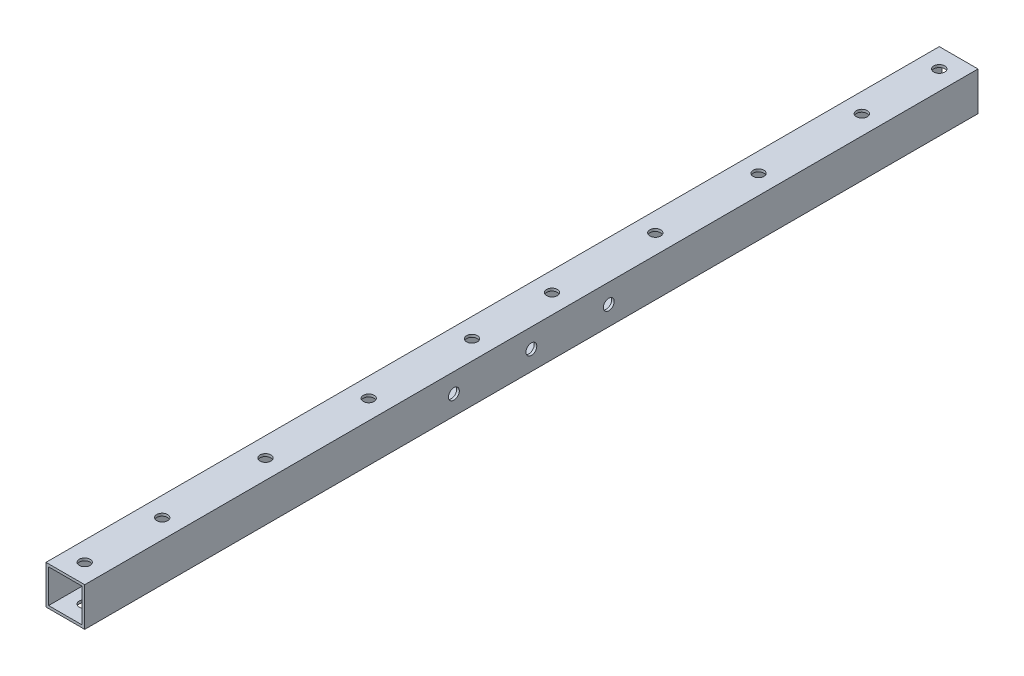
ISO-10303-21;
HEADER;
FILE_DESCRIPTION(('STEP AP214'),'2;1');
FILE_NAME('part.step','',(''),(''),'','','');
FILE_SCHEMA(('AUTOMOTIVE_DESIGN { 1 0 10303 214 1 1 1 1 }'));
ENDSEC;
DATA;
#1=APPLICATION_CONTEXT('core data for automotive mechanical design processes');
#2=APPLICATION_PROTOCOL_DEFINITION('international standard','automotive_design',2000,#1);
#3=PRODUCT_CONTEXT('',#1,'mechanical');
#4=PRODUCT('Part','Part','',(#3));
#5=PRODUCT_RELATED_PRODUCT_CATEGORY('part','',(#4));
#6=PRODUCT_DEFINITION_FORMATION('','',#4);
#7=PRODUCT_DEFINITION_CONTEXT('part definition',#1,'design');
#8=PRODUCT_DEFINITION('design','',#6,#7);
#9=PRODUCT_DEFINITION_SHAPE('','',#8);
#10=(LENGTH_UNIT() NAMED_UNIT(*) SI_UNIT(.MILLI.,.METRE.));
#11=(NAMED_UNIT(*) PLANE_ANGLE_UNIT() SI_UNIT($,.RADIAN.));
#12=(NAMED_UNIT(*) SI_UNIT($,.STERADIAN.) SOLID_ANGLE_UNIT());
#13=UNCERTAINTY_MEASURE_WITH_UNIT(LENGTH_MEASURE(1.E-05),#10,'distance_accuracy_value','');
#14=(GEOMETRIC_REPRESENTATION_CONTEXT(3) GLOBAL_UNCERTAINTY_ASSIGNED_CONTEXT((#13)) GLOBAL_UNIT_ASSIGNED_CONTEXT((#10,
#11,#12)) REPRESENTATION_CONTEXT('',''));
#15=CARTESIAN_POINT('',(0.,0.,0.));
#16=DIRECTION('',(0.,0.,1.));
#17=DIRECTION('',(1.,0.,0.));
#18=AXIS2_PLACEMENT_3D('',#15,#16,#17);
#19=CARTESIAN_POINT('',(0.,0.,346.));
#20=DIRECTION('',(0.,0.,1.));
#21=DIRECTION('',(1.,0.,0.));
#22=AXIS2_PLACEMENT_3D('',#19,#20,#21);
#23=PLANE('',#22);
#24=DIRECTION('',(0.,1.,0.));
#25=VECTOR('',#24,1.);
#26=CARTESIAN_POINT('',(7.5,7.5,346.));
#27=LINE('',#26,#25);
#28=CARTESIAN_POINT('',(7.5,-7.5,346.));
#29=VERTEX_POINT('',#28);
#30=CARTESIAN_POINT('',(7.5,7.5,346.));
#31=VERTEX_POINT('',#30);
#32=EDGE_CURVE('E147',#29,#31,#27,.T.);
#33=ORIENTED_EDGE('',*,*,#32,.T.);
#34=DIRECTION('',(-1.,0.,0.));
#35=VECTOR('',#34,1.);
#36=CARTESIAN_POINT('',(-7.5,7.5,346.));
#37=LINE('',#36,#35);
#38=CARTESIAN_POINT('',(-7.5,7.5,346.));
#39=VERTEX_POINT('',#38);
#40=EDGE_CURVE('E146',#31,#39,#37,.T.);
#41=ORIENTED_EDGE('',*,*,#40,.T.);
#42=DIRECTION('',(0.,-1.,0.));
#43=VECTOR('',#42,1.);
#44=CARTESIAN_POINT('',(-7.5,7.5,346.));
#45=LINE('',#44,#43);
#46=CARTESIAN_POINT('',(-7.5,-7.5,346.));
#47=VERTEX_POINT('',#46);
#48=EDGE_CURVE('E151',#39,#47,#45,.T.);
#49=ORIENTED_EDGE('',*,*,#48,.T.);
#50=DIRECTION('',(1.,0.,0.));
#51=VECTOR('',#50,1.);
#52=CARTESIAN_POINT('',(-7.5,-7.5,346.));
#53=LINE('',#52,#51);
#54=EDGE_CURVE('E153',#47,#29,#53,.T.);
#55=ORIENTED_EDGE('',*,*,#54,.T.);
#56=EDGE_LOOP('',(#33,#41,#49,#55));
#57=FACE_BOUND('',#56,.T.);
#58=DIRECTION('',(-1.,0.,0.));
#59=VECTOR('',#58,1.);
#60=CARTESIAN_POINT('',(-6.5,6.5,346.));
#61=LINE('',#60,#59);
#62=CARTESIAN_POINT('',(6.5,6.5,346.));
#63=VERTEX_POINT('',#62);
#64=CARTESIAN_POINT('',(-6.5,6.5,346.));
#65=VERTEX_POINT('',#64);
#66=EDGE_CURVE('E116',#63,#65,#61,.T.);
#67=ORIENTED_EDGE('',*,*,#66,.F.);
#68=DIRECTION('',(0.,1.,0.));
#69=VECTOR('',#68,1.);
#70=CARTESIAN_POINT('',(6.5,6.5,346.));
#71=LINE('',#70,#69);
#72=CARTESIAN_POINT('',(6.5,-6.5,346.));
#73=VERTEX_POINT('',#72);
#74=EDGE_CURVE('E108',#73,#63,#71,.T.);
#75=ORIENTED_EDGE('',*,*,#74,.F.);
#76=DIRECTION('',(1.,0.,0.));
#77=VECTOR('',#76,1.);
#78=CARTESIAN_POINT('',(-6.5,-6.5,346.));
#79=LINE('',#78,#77);
#80=CARTESIAN_POINT('',(-6.5,-6.5,346.));
#81=VERTEX_POINT('',#80);
#82=EDGE_CURVE('E128',#81,#73,#79,.T.);
#83=ORIENTED_EDGE('',*,*,#82,.F.);
#84=DIRECTION('',(0.,-1.,0.));
#85=VECTOR('',#84,1.);
#86=CARTESIAN_POINT('',(-6.5,6.5,346.));
#87=LINE('',#86,#85);
#88=EDGE_CURVE('E129',#65,#81,#87,.T.);
#89=ORIENTED_EDGE('',*,*,#88,.F.);
#90=EDGE_LOOP('',(#67,#75,#83,#89));
#91=FACE_BOUND('',#90,.T.);
#92=ADVANCED_FACE('F41',(#57,#91),#23,.T.);
#93=CARTESIAN_POINT('',(0.,0.,0.));
#94=DIRECTION('',(0.,0.,1.));
#95=DIRECTION('',(1.,0.,0.));
#96=AXIS2_PLACEMENT_3D('',#93,#94,#95);
#97=PLANE('',#96);
#98=DIRECTION('',(0.,1.,0.));
#99=VECTOR('',#98,1.);
#100=CARTESIAN_POINT('',(7.5,7.5,0.));
#101=LINE('',#100,#99);
#102=CARTESIAN_POINT('',(7.5,-7.5,0.));
#103=VERTEX_POINT('',#102);
#104=CARTESIAN_POINT('',(7.5,7.5,0.));
#105=VERTEX_POINT('',#104);
#106=EDGE_CURVE('E121',#103,#105,#101,.T.);
#107=ORIENTED_EDGE('',*,*,#106,.F.);
#108=DIRECTION('',(1.,0.,0.));
#109=VECTOR('',#108,1.);
#110=CARTESIAN_POINT('',(-7.5,-7.5,0.));
#111=LINE('',#110,#109);
#112=CARTESIAN_POINT('',(-7.5,-7.5,0.));
#113=VERTEX_POINT('',#112);
#114=EDGE_CURVE('E148',#113,#103,#111,.T.);
#115=ORIENTED_EDGE('',*,*,#114,.F.);
#116=DIRECTION('',(0.,-1.,0.));
#117=VECTOR('',#116,1.);
#118=CARTESIAN_POINT('',(-7.5,7.5,0.));
#119=LINE('',#118,#117);
#120=CARTESIAN_POINT('',(-7.5,7.5,0.));
#121=VERTEX_POINT('',#120);
#122=EDGE_CURVE('E163',#121,#113,#119,.T.);
#123=ORIENTED_EDGE('',*,*,#122,.F.);
#124=DIRECTION('',(-1.,0.,0.));
#125=VECTOR('',#124,1.);
#126=CARTESIAN_POINT('',(-7.5,7.5,0.));
#127=LINE('',#126,#125);
#128=EDGE_CURVE('E156',#105,#121,#127,.T.);
#129=ORIENTED_EDGE('',*,*,#128,.F.);
#130=EDGE_LOOP('',(#107,#115,#123,#129));
#131=FACE_BOUND('',#130,.T.);
#132=DIRECTION('',(0.,1.,0.));
#133=VECTOR('',#132,1.);
#134=CARTESIAN_POINT('',(6.5,6.5,0.));
#135=LINE('',#134,#133);
#136=CARTESIAN_POINT('',(6.5,-6.5,0.));
#137=VERTEX_POINT('',#136);
#138=CARTESIAN_POINT('',(6.5,6.5,0.));
#139=VERTEX_POINT('',#138);
#140=EDGE_CURVE('E69',#137,#139,#135,.T.);
#141=ORIENTED_EDGE('',*,*,#140,.T.);
#142=DIRECTION('',(-1.,0.,0.));
#143=VECTOR('',#142,1.);
#144=CARTESIAN_POINT('',(-6.5,6.5,0.));
#145=LINE('',#144,#143);
#146=CARTESIAN_POINT('',(-6.5,6.5,0.));
#147=VERTEX_POINT('',#146);
#148=EDGE_CURVE('E124',#139,#147,#145,.T.);
#149=ORIENTED_EDGE('',*,*,#148,.T.);
#150=DIRECTION('',(0.,-1.,0.));
#151=VECTOR('',#150,1.);
#152=CARTESIAN_POINT('',(-6.5,6.5,0.));
#153=LINE('',#152,#151);
#154=CARTESIAN_POINT('',(-6.5,-6.5,0.));
#155=VERTEX_POINT('',#154);
#156=EDGE_CURVE('E139',#147,#155,#153,.T.);
#157=ORIENTED_EDGE('',*,*,#156,.T.);
#158=DIRECTION('',(1.,0.,0.));
#159=VECTOR('',#158,1.);
#160=CARTESIAN_POINT('',(-6.5,-6.5,0.));
#161=LINE('',#160,#159);
#162=EDGE_CURVE('E120',#155,#137,#161,.T.);
#163=ORIENTED_EDGE('',*,*,#162,.T.);
#164=EDGE_LOOP('',(#141,#149,#157,#163));
#165=FACE_BOUND('',#164,.T.);
#166=ADVANCED_FACE('F349',(#131,#165),#97,.F.);
#167=CARTESIAN_POINT('',(7.5,7.5,346.));
#168=DIRECTION('',(-1.,0.,0.));
#169=DIRECTION('',(0.,0.,1.));
#170=AXIS2_PLACEMENT_3D('',#167,#168,#169);
#171=PLANE('',#170);
#172=CARTESIAN_POINT('',(7.5,0.,143.));
#173=DIRECTION('',(1.,0.,0.));
#174=DIRECTION('',(0.,0.,-1.));
#175=AXIS2_PLACEMENT_3D('',#172,#173,#174);
#176=CIRCLE('',#175,2.09999999999999);
#177=CARTESIAN_POINT('',(7.5,0.,140.9));
#178=VERTEX_POINT('',#177);
#179=EDGE_CURVE('E763',#178,#178,#176,.T.);
#180=ORIENTED_EDGE('',*,*,#179,.F.);
#181=EDGE_LOOP('',(#180));
#182=FACE_BOUND('',#181,.T.);
#183=CARTESIAN_POINT('',(7.5,0.,203.));
#184=DIRECTION('',(1.,0.,0.));
#185=DIRECTION('',(0.,0.,-1.));
#186=AXIS2_PLACEMENT_3D('',#183,#184,#185);
#187=CIRCLE('',#186,2.09999999999999);
#188=CARTESIAN_POINT('',(7.5,0.,200.9));
#189=VERTEX_POINT('',#188);
#190=EDGE_CURVE('E762',#189,#189,#187,.T.);
#191=ORIENTED_EDGE('',*,*,#190,.F.);
#192=EDGE_LOOP('',(#191));
#193=FACE_BOUND('',#192,.T.);
#194=CARTESIAN_POINT('',(7.5,0.,173.));
#195=DIRECTION('',(1.,0.,0.));
#196=DIRECTION('',(0.,0.,-1.));
#197=AXIS2_PLACEMENT_3D('',#194,#195,#196);
#198=CIRCLE('',#197,2.09999999999999);
#199=CARTESIAN_POINT('',(7.5,0.,170.9));
#200=VERTEX_POINT('',#199);
#201=EDGE_CURVE('E221',#200,#200,#198,.T.);
#202=ORIENTED_EDGE('',*,*,#201,.F.);
#203=EDGE_LOOP('',(#202));
#204=FACE_BOUND('',#203,.T.);
#205=ORIENTED_EDGE('',*,*,#106,.T.);
#206=DIRECTION('',(0.,0.,-1.));
#207=VECTOR('',#206,1.);
#208=CARTESIAN_POINT('',(7.5,7.5,346.));
#209=LINE('',#208,#207);
#210=EDGE_CURVE('E11',#31,#105,#209,.T.);
#211=ORIENTED_EDGE('',*,*,#210,.F.);
#212=ORIENTED_EDGE('',*,*,#32,.F.);
#213=DIRECTION('',(0.,0.,-1.));
#214=VECTOR('',#213,1.);
#215=CARTESIAN_POINT('',(7.5,-7.5,346.));
#216=LINE('',#215,#214);
#217=EDGE_CURVE('E157',#29,#103,#216,.T.);
#218=ORIENTED_EDGE('',*,*,#217,.T.);
#219=EDGE_LOOP('',(#205,#211,#212,#218));
#220=FACE_BOUND('',#219,.T.);
#221=ADVANCED_FACE('F43',(#182,#193,#204,#220),#171,.F.);
#222=CARTESIAN_POINT('',(-7.5,7.5,346.));
#223=DIRECTION('',(0.,-1.,0.));
#224=DIRECTION('',(0.,0.,-1.));
#225=AXIS2_PLACEMENT_3D('',#222,#223,#224);
#226=PLANE('',#225);
#227=CARTESIAN_POINT('',(0.,7.5,338.5));
#228=DIRECTION('',(0.,1.,0.));
#229=DIRECTION('',(0.,0.,1.));
#230=AXIS2_PLACEMENT_3D('',#227,#228,#229);
#231=CIRCLE('',#230,2.1);
#232=CARTESIAN_POINT('',(0.,7.5,340.6));
#233=VERTEX_POINT('',#232);
#234=EDGE_CURVE('E174',#233,#233,#231,.T.);
#235=ORIENTED_EDGE('',*,*,#234,.F.);
#236=EDGE_LOOP('',(#235));
#237=FACE_BOUND('',#236,.T.);
#238=CARTESIAN_POINT('',(0.,7.5,188.5));
#239=DIRECTION('',(0.,1.,0.));
#240=DIRECTION('',(0.,0.,-1.));
#241=AXIS2_PLACEMENT_3D('',#238,#239,#240);
#242=CIRCLE('',#241,2.1);
#243=CARTESIAN_POINT('',(0.,7.5,186.4));
#244=VERTEX_POINT('',#243);
#245=EDGE_CURVE('E249',#244,#244,#242,.T.);
#246=ORIENTED_EDGE('',*,*,#245,.F.);
#247=EDGE_LOOP('',(#246));
#248=FACE_BOUND('',#247,.T.);
#249=CARTESIAN_POINT('',(0.,7.5,7.5));
#250=DIRECTION('',(0.,1.,0.));
#251=DIRECTION('',(0.,0.,1.));
#252=AXIS2_PLACEMENT_3D('',#249,#250,#251);
#253=CIRCLE('',#252,2.1);
#254=CARTESIAN_POINT('',(0.,7.5,9.6));
#255=VERTEX_POINT('',#254);
#256=EDGE_CURVE('E254',#255,#255,#253,.T.);
#257=ORIENTED_EDGE('',*,*,#256,.F.);
#258=EDGE_LOOP('',(#257));
#259=FACE_BOUND('',#258,.T.);
#260=CARTESIAN_POINT('',(0.,7.5,37.5));
#261=DIRECTION('',(0.,1.,0.));
#262=DIRECTION('',(0.,0.,1.));
#263=AXIS2_PLACEMENT_3D('',#260,#261,#262);
#264=CIRCLE('',#263,2.1);
#265=CARTESIAN_POINT('',(0.,7.5,39.6));
#266=VERTEX_POINT('',#265);
#267=EDGE_CURVE('E272',#266,#266,#264,.T.);
#268=ORIENTED_EDGE('',*,*,#267,.F.);
#269=EDGE_LOOP('',(#268));
#270=FACE_BOUND('',#269,.T.);
#271=CARTESIAN_POINT('',(0.,7.5,308.5));
#272=DIRECTION('',(0.,1.,0.));
#273=DIRECTION('',(0.,0.,1.));
#274=AXIS2_PLACEMENT_3D('',#271,#272,#273);
#275=CIRCLE('',#274,2.1);
#276=CARTESIAN_POINT('',(0.,7.5,310.6));
#277=VERTEX_POINT('',#276);
#278=EDGE_CURVE('E274',#277,#277,#275,.T.);
#279=ORIENTED_EDGE('',*,*,#278,.F.);
#280=EDGE_LOOP('',(#279));
#281=FACE_BOUND('',#280,.T.);
#282=CARTESIAN_POINT('',(0.,7.5,77.5));
#283=DIRECTION('',(0.,1.,0.));
#284=DIRECTION('',(0.,0.,1.));
#285=AXIS2_PLACEMENT_3D('',#282,#283,#284);
#286=CIRCLE('',#285,2.1);
#287=CARTESIAN_POINT('',(0.,7.5,79.6));
#288=VERTEX_POINT('',#287);
#289=EDGE_CURVE('E267',#288,#288,#286,.T.);
#290=ORIENTED_EDGE('',*,*,#289,.F.);
#291=EDGE_LOOP('',(#290));
#292=FACE_BOUND('',#291,.T.);
#293=CARTESIAN_POINT('',(0.,7.5,157.5));
#294=DIRECTION('',(0.,1.,0.));
#295=DIRECTION('',(0.,0.,1.));
#296=AXIS2_PLACEMENT_3D('',#293,#294,#295);
#297=CIRCLE('',#296,2.1);
#298=CARTESIAN_POINT('',(0.,7.5,159.6));
#299=VERTEX_POINT('',#298);
#300=EDGE_CURVE('E257',#299,#299,#297,.T.);
#301=ORIENTED_EDGE('',*,*,#300,.F.);
#302=EDGE_LOOP('',(#301));
#303=FACE_BOUND('',#302,.T.);
#304=CARTESIAN_POINT('',(0.,7.5,268.5));
#305=DIRECTION('',(0.,1.,0.));
#306=DIRECTION('',(0.,0.,-1.));
#307=AXIS2_PLACEMENT_3D('',#304,#305,#306);
#308=CIRCLE('',#307,2.1);
#309=CARTESIAN_POINT('',(0.,7.5,266.4));
#310=VERTEX_POINT('',#309);
#311=EDGE_CURVE('E260',#310,#310,#308,.T.);
#312=ORIENTED_EDGE('',*,*,#311,.F.);
#313=EDGE_LOOP('',(#312));
#314=FACE_BOUND('',#313,.T.);
#315=CARTESIAN_POINT('',(0.,7.5,228.5));
#316=DIRECTION('',(0.,1.,0.));
#317=DIRECTION('',(0.,0.,-1.));
#318=AXIS2_PLACEMENT_3D('',#315,#316,#317);
#319=CIRCLE('',#318,2.1);
#320=CARTESIAN_POINT('',(0.,7.5,226.4));
#321=VERTEX_POINT('',#320);
#322=EDGE_CURVE('E258',#321,#321,#319,.T.);
#323=ORIENTED_EDGE('',*,*,#322,.F.);
#324=EDGE_LOOP('',(#323));
#325=FACE_BOUND('',#324,.T.);
#326=CARTESIAN_POINT('',(0.,7.5,117.5));
#327=DIRECTION('',(0.,1.,0.));
#328=DIRECTION('',(0.,0.,1.));
#329=AXIS2_PLACEMENT_3D('',#326,#327,#328);
#330=CIRCLE('',#329,2.1);
#331=CARTESIAN_POINT('',(0.,7.5,119.6));
#332=VERTEX_POINT('',#331);
#333=EDGE_CURVE('E265',#332,#332,#330,.T.);
#334=ORIENTED_EDGE('',*,*,#333,.F.);
#335=EDGE_LOOP('',(#334));
#336=FACE_BOUND('',#335,.T.);
#337=ORIENTED_EDGE('',*,*,#128,.T.);
#338=DIRECTION('',(0.,0.,-1.));
#339=VECTOR('',#338,1.);
#340=CARTESIAN_POINT('',(-7.5,7.5,346.));
#341=LINE('',#340,#339);
#342=EDGE_CURVE('E49',#39,#121,#341,.T.);
#343=ORIENTED_EDGE('',*,*,#342,.F.);
#344=ORIENTED_EDGE('',*,*,#40,.F.);
#345=ORIENTED_EDGE('',*,*,#210,.T.);
#346=EDGE_LOOP('',(#337,#343,#344,#345));
#347=FACE_BOUND('',#346,.T.);
#348=ADVANCED_FACE('F363',(#237,#248,#259,#270,#281,#292,#303,#314,#325,#336,#347),#226,.F.);
#349=CARTESIAN_POINT('',(-7.5,7.5,346.));
#350=DIRECTION('',(1.,0.,0.));
#351=DIRECTION('',(0.,0.,-1.));
#352=AXIS2_PLACEMENT_3D('',#349,#350,#351);
#353=PLANE('',#352);
#354=CARTESIAN_POINT('',(-7.49999999999999,0.,143.));
#355=DIRECTION('',(1.,0.,0.));
#356=DIRECTION('',(0.,0.,-1.));
#357=AXIS2_PLACEMENT_3D('',#354,#355,#356);
#358=CIRCLE('',#357,2.09999999999999);
#359=CARTESIAN_POINT('',(-7.49999999999999,0.,140.9));
#360=VERTEX_POINT('',#359);
#361=EDGE_CURVE('E250',#360,#360,#358,.T.);
#362=ORIENTED_EDGE('',*,*,#361,.T.);
#363=EDGE_LOOP('',(#362));
#364=FACE_BOUND('',#363,.T.);
#365=CARTESIAN_POINT('',(-7.49999999999999,0.,203.));
#366=DIRECTION('',(1.,0.,0.));
#367=DIRECTION('',(0.,0.,-1.));
#368=AXIS2_PLACEMENT_3D('',#365,#366,#367);
#369=CIRCLE('',#368,2.09999999999999);
#370=CARTESIAN_POINT('',(-7.49999999999999,0.,200.9));
#371=VERTEX_POINT('',#370);
#372=EDGE_CURVE('E235',#371,#371,#369,.T.);
#373=ORIENTED_EDGE('',*,*,#372,.T.);
#374=EDGE_LOOP('',(#373));
#375=FACE_BOUND('',#374,.T.);
#376=CARTESIAN_POINT('',(-7.49999999999999,0.,173.));
#377=DIRECTION('',(1.,0.,0.));
#378=DIRECTION('',(0.,0.,-1.));
#379=AXIS2_PLACEMENT_3D('',#376,#377,#378);
#380=CIRCLE('',#379,2.09999999999999);
#381=CARTESIAN_POINT('',(-7.49999999999999,0.,170.9));
#382=VERTEX_POINT('',#381);
#383=EDGE_CURVE('E226',#382,#382,#380,.T.);
#384=ORIENTED_EDGE('',*,*,#383,.T.);
#385=EDGE_LOOP('',(#384));
#386=FACE_BOUND('',#385,.T.);
#387=ORIENTED_EDGE('',*,*,#122,.T.);
#388=DIRECTION('',(0.,0.,-1.));
#389=VECTOR('',#388,1.);
#390=CARTESIAN_POINT('',(-7.5,-7.5,346.));
#391=LINE('',#390,#389);
#392=EDGE_CURVE('E168',#47,#113,#391,.T.);
#393=ORIENTED_EDGE('',*,*,#392,.F.);
#394=ORIENTED_EDGE('',*,*,#48,.F.);
#395=ORIENTED_EDGE('',*,*,#342,.T.);
#396=EDGE_LOOP('',(#387,#393,#394,#395));
#397=FACE_BOUND('',#396,.T.);
#398=ADVANCED_FACE('F360',(#364,#375,#386,#397),#353,.F.);
#399=CARTESIAN_POINT('',(-7.5,-7.5,346.));
#400=DIRECTION('',(0.,1.,0.));
#401=DIRECTION('',(0.,0.,1.));
#402=AXIS2_PLACEMENT_3D('',#399,#400,#401);
#403=PLANE('',#402);
#404=CARTESIAN_POINT('',(0.,-7.49999999999999,338.5));
#405=DIRECTION('',(0.,1.,0.));
#406=DIRECTION('',(0.,0.,1.));
#407=AXIS2_PLACEMENT_3D('',#404,#405,#406);
#408=CIRCLE('',#407,2.1);
#409=CARTESIAN_POINT('',(0.,-7.49999999999999,340.6));
#410=VERTEX_POINT('',#409);
#411=EDGE_CURVE('E137',#410,#410,#408,.T.);
#412=ORIENTED_EDGE('',*,*,#411,.T.);
#413=EDGE_LOOP('',(#412));
#414=FACE_BOUND('',#413,.T.);
#415=CARTESIAN_POINT('',(0.,-7.49999999999999,188.5));
#416=DIRECTION('',(0.,1.,0.));
#417=DIRECTION('',(0.,0.,1.));
#418=AXIS2_PLACEMENT_3D('',#415,#416,#417);
#419=CIRCLE('',#418,2.1);
#420=CARTESIAN_POINT('',(0.,-7.49999999999999,190.6));
#421=VERTEX_POINT('',#420);
#422=EDGE_CURVE('E217',#421,#421,#419,.T.);
#423=ORIENTED_EDGE('',*,*,#422,.T.);
#424=EDGE_LOOP('',(#423));
#425=FACE_BOUND('',#424,.T.);
#426=CARTESIAN_POINT('',(0.,-7.49999999999999,7.5));
#427=DIRECTION('',(0.,1.,0.));
#428=DIRECTION('',(0.,0.,1.));
#429=AXIS2_PLACEMENT_3D('',#426,#427,#428);
#430=CIRCLE('',#429,2.1);
#431=CARTESIAN_POINT('',(0.,-7.49999999999999,9.6));
#432=VERTEX_POINT('',#431);
#433=EDGE_CURVE('E213',#432,#432,#430,.T.);
#434=ORIENTED_EDGE('',*,*,#433,.T.);
#435=EDGE_LOOP('',(#434));
#436=FACE_BOUND('',#435,.T.);
#437=CARTESIAN_POINT('',(0.,-7.49999999999999,37.5));
#438=DIRECTION('',(0.,1.,0.));
#439=DIRECTION('',(0.,0.,1.));
#440=AXIS2_PLACEMENT_3D('',#437,#438,#439);
#441=CIRCLE('',#440,2.1);
#442=CARTESIAN_POINT('',(0.,-7.49999999999999,39.6));
#443=VERTEX_POINT('',#442);
#444=EDGE_CURVE('E208',#443,#443,#441,.T.);
#445=ORIENTED_EDGE('',*,*,#444,.T.);
#446=EDGE_LOOP('',(#445));
#447=FACE_BOUND('',#446,.T.);
#448=CARTESIAN_POINT('',(0.,-7.49999999999999,308.5));
#449=DIRECTION('',(0.,1.,0.));
#450=DIRECTION('',(0.,0.,1.));
#451=AXIS2_PLACEMENT_3D('',#448,#449,#450);
#452=CIRCLE('',#451,2.1);
#453=CARTESIAN_POINT('',(0.,-7.49999999999999,310.6));
#454=VERTEX_POINT('',#453);
#455=EDGE_CURVE('E203',#454,#454,#452,.T.);
#456=ORIENTED_EDGE('',*,*,#455,.T.);
#457=EDGE_LOOP('',(#456));
#458=FACE_BOUND('',#457,.T.);
#459=CARTESIAN_POINT('',(0.,-7.49999999999999,77.5));
#460=DIRECTION('',(0.,1.,0.));
#461=DIRECTION('',(0.,0.,1.));
#462=AXIS2_PLACEMENT_3D('',#459,#460,#461);
#463=CIRCLE('',#462,2.1);
#464=CARTESIAN_POINT('',(0.,-7.49999999999999,79.6));
#465=VERTEX_POINT('',#464);
#466=EDGE_CURVE('E197',#465,#465,#463,.T.);
#467=ORIENTED_EDGE('',*,*,#466,.T.);
#468=EDGE_LOOP('',(#467));
#469=FACE_BOUND('',#468,.T.);
#470=CARTESIAN_POINT('',(0.,-7.49999999999999,157.5));
#471=DIRECTION('',(0.,1.,0.));
#472=DIRECTION('',(0.,0.,1.));
#473=AXIS2_PLACEMENT_3D('',#470,#471,#472);
#474=CIRCLE('',#473,2.1);
#475=CARTESIAN_POINT('',(0.,-7.49999999999999,159.6));
#476=VERTEX_POINT('',#475);
#477=EDGE_CURVE('E193',#476,#476,#474,.T.);
#478=ORIENTED_EDGE('',*,*,#477,.T.);
#479=EDGE_LOOP('',(#478));
#480=FACE_BOUND('',#479,.T.);
#481=CARTESIAN_POINT('',(0.,-7.49999999999999,268.5));
#482=DIRECTION('',(0.,1.,0.));
#483=DIRECTION('',(0.,0.,1.));
#484=AXIS2_PLACEMENT_3D('',#481,#482,#483);
#485=CIRCLE('',#484,2.1);
#486=CARTESIAN_POINT('',(0.,-7.49999999999999,270.6));
#487=VERTEX_POINT('',#486);
#488=EDGE_CURVE('E188',#487,#487,#485,.T.);
#489=ORIENTED_EDGE('',*,*,#488,.T.);
#490=EDGE_LOOP('',(#489));
#491=FACE_BOUND('',#490,.T.);
#492=CARTESIAN_POINT('',(0.,-7.49999999999999,228.5));
#493=DIRECTION('',(0.,1.,0.));
#494=DIRECTION('',(0.,0.,1.));
#495=AXIS2_PLACEMENT_3D('',#492,#493,#494);
#496=CIRCLE('',#495,2.1);
#497=CARTESIAN_POINT('',(0.,-7.49999999999999,230.6));
#498=VERTEX_POINT('',#497);
#499=EDGE_CURVE('E184',#498,#498,#496,.T.);
#500=ORIENTED_EDGE('',*,*,#499,.T.);
#501=EDGE_LOOP('',(#500));
#502=FACE_BOUND('',#501,.T.);
#503=CARTESIAN_POINT('',(0.,-7.49999999999999,117.5));
#504=DIRECTION('',(0.,1.,0.));
#505=DIRECTION('',(0.,0.,1.));
#506=AXIS2_PLACEMENT_3D('',#503,#504,#505);
#507=CIRCLE('',#506,2.1);
#508=CARTESIAN_POINT('',(0.,-7.49999999999999,119.6));
#509=VERTEX_POINT('',#508);
#510=EDGE_CURVE('E179',#509,#509,#507,.T.);
#511=ORIENTED_EDGE('',*,*,#510,.T.);
#512=EDGE_LOOP('',(#511));
#513=FACE_BOUND('',#512,.T.);
#514=ORIENTED_EDGE('',*,*,#114,.T.);
#515=ORIENTED_EDGE('',*,*,#217,.F.);
#516=ORIENTED_EDGE('',*,*,#54,.F.);
#517=ORIENTED_EDGE('',*,*,#392,.T.);
#518=EDGE_LOOP('',(#514,#515,#516,#517));
#519=FACE_BOUND('',#518,.T.);
#520=ADVANCED_FACE('F316',(#414,#425,#436,#447,#458,#469,#480,#491,#502,#513,#519),#403,.F.);
#521=CARTESIAN_POINT('',(6.5,6.5,346.));
#522=DIRECTION('',(-1.,0.,0.));
#523=DIRECTION('',(0.,0.,1.));
#524=AXIS2_PLACEMENT_3D('',#521,#522,#523);
#525=PLANE('',#524);
#526=CARTESIAN_POINT('',(6.5,0.,143.));
#527=DIRECTION('',(-1.,0.,0.));
#528=DIRECTION('',(0.,0.,1.));
#529=AXIS2_PLACEMENT_3D('',#526,#527,#528);
#530=CIRCLE('',#529,2.09999999999999);
#531=CARTESIAN_POINT('',(6.5,0.,145.1));
#532=VERTEX_POINT('',#531);
#533=EDGE_CURVE('E242',#532,#532,#530,.T.);
#534=ORIENTED_EDGE('',*,*,#533,.F.);
#535=EDGE_LOOP('',(#534));
#536=FACE_BOUND('',#535,.T.);
#537=CARTESIAN_POINT('',(6.5,0.,203.));
#538=DIRECTION('',(-1.,0.,0.));
#539=DIRECTION('',(0.,0.,1.));
#540=AXIS2_PLACEMENT_3D('',#537,#538,#539);
#541=CIRCLE('',#540,2.09999999999999);
#542=CARTESIAN_POINT('',(6.5,0.,205.1));
#543=VERTEX_POINT('',#542);
#544=EDGE_CURVE('E227',#543,#543,#541,.T.);
#545=ORIENTED_EDGE('',*,*,#544,.F.);
#546=EDGE_LOOP('',(#545));
#547=FACE_BOUND('',#546,.T.);
#548=CARTESIAN_POINT('',(6.5,0.,173.));
#549=DIRECTION('',(-1.,0.,0.));
#550=DIRECTION('',(0.,0.,1.));
#551=AXIS2_PLACEMENT_3D('',#548,#549,#550);
#552=CIRCLE('',#551,2.09999999999999);
#553=CARTESIAN_POINT('',(6.5,0.,175.1));
#554=VERTEX_POINT('',#553);
#555=EDGE_CURVE('E224',#554,#554,#552,.T.);
#556=ORIENTED_EDGE('',*,*,#555,.F.);
#557=EDGE_LOOP('',(#556));
#558=FACE_BOUND('',#557,.T.);
#559=ORIENTED_EDGE('',*,*,#140,.F.);
#560=DIRECTION('',(0.,0.,-1.));
#561=VECTOR('',#560,1.);
#562=CARTESIAN_POINT('',(6.5,-6.5,346.));
#563=LINE('',#562,#561);
#564=EDGE_CURVE('E115',#73,#137,#563,.T.);
#565=ORIENTED_EDGE('',*,*,#564,.F.);
#566=ORIENTED_EDGE('',*,*,#74,.T.);
#567=DIRECTION('',(0.,0.,-1.));
#568=VECTOR('',#567,1.);
#569=CARTESIAN_POINT('',(6.5,6.5,346.));
#570=LINE('',#569,#568);
#571=EDGE_CURVE('E111',#63,#139,#570,.T.);
#572=ORIENTED_EDGE('',*,*,#571,.T.);
#573=EDGE_LOOP('',(#559,#565,#566,#572));
#574=FACE_BOUND('',#573,.T.);
#575=ADVANCED_FACE('F109',(#536,#547,#558,#574),#525,.T.);
#576=CARTESIAN_POINT('',(-6.5,6.5,346.));
#577=DIRECTION('',(0.,-1.,0.));
#578=DIRECTION('',(0.,0.,-1.));
#579=AXIS2_PLACEMENT_3D('',#576,#577,#578);
#580=PLANE('',#579);
#581=CARTESIAN_POINT('',(0.,6.5,338.5));
#582=DIRECTION('',(0.,-1.,0.));
#583=DIRECTION('',(0.,0.,-1.));
#584=AXIS2_PLACEMENT_3D('',#581,#582,#583);
#585=CIRCLE('',#584,2.1);
#586=CARTESIAN_POINT('',(0.,6.5,336.4));
#587=VERTEX_POINT('',#586);
#588=EDGE_CURVE('E218',#587,#587,#585,.T.);
#589=ORIENTED_EDGE('',*,*,#588,.F.);
#590=EDGE_LOOP('',(#589));
#591=FACE_BOUND('',#590,.T.);
#592=CARTESIAN_POINT('',(0.,6.5,188.5));
#593=DIRECTION('',(0.,-1.,0.));
#594=DIRECTION('',(0.,0.,-1.));
#595=AXIS2_PLACEMENT_3D('',#592,#593,#594);
#596=CIRCLE('',#595,2.1);
#597=CARTESIAN_POINT('',(0.,6.5,186.4));
#598=VERTEX_POINT('',#597);
#599=EDGE_CURVE('E211',#598,#598,#596,.T.);
#600=ORIENTED_EDGE('',*,*,#599,.F.);
#601=EDGE_LOOP('',(#600));
#602=FACE_BOUND('',#601,.T.);
#603=CARTESIAN_POINT('',(0.,6.5,7.5));
#604=DIRECTION('',(0.,-1.,0.));
#605=DIRECTION('',(0.,0.,-1.));
#606=AXIS2_PLACEMENT_3D('',#603,#604,#605);
#607=CIRCLE('',#606,2.1);
#608=CARTESIAN_POINT('',(0.,6.5,5.4));
#609=VERTEX_POINT('',#608);
#610=EDGE_CURVE('E209',#609,#609,#607,.T.);
#611=ORIENTED_EDGE('',*,*,#610,.F.);
#612=EDGE_LOOP('',(#611));
#613=FACE_BOUND('',#612,.T.);
#614=CARTESIAN_POINT('',(0.,6.5,37.5));
#615=DIRECTION('',(0.,-1.,0.));
#616=DIRECTION('',(0.,0.,-1.));
#617=AXIS2_PLACEMENT_3D('',#614,#615,#616);
#618=CIRCLE('',#617,2.1);
#619=CARTESIAN_POINT('',(0.,6.5,35.4));
#620=VERTEX_POINT('',#619);
#621=EDGE_CURVE('E201',#620,#620,#618,.T.);
#622=ORIENTED_EDGE('',*,*,#621,.F.);
#623=EDGE_LOOP('',(#622));
#624=FACE_BOUND('',#623,.T.);
#625=CARTESIAN_POINT('',(0.,6.5,308.5));
#626=DIRECTION('',(0.,-1.,0.));
#627=DIRECTION('',(0.,0.,-1.));
#628=AXIS2_PLACEMENT_3D('',#625,#626,#627);
#629=CIRCLE('',#628,2.1);
#630=CARTESIAN_POINT('',(0.,6.5,306.4));
#631=VERTEX_POINT('',#630);
#632=EDGE_CURVE('E198',#631,#631,#629,.T.);
#633=ORIENTED_EDGE('',*,*,#632,.F.);
#634=EDGE_LOOP('',(#633));
#635=FACE_BOUND('',#634,.T.);
#636=CARTESIAN_POINT('',(0.,6.5,77.5));
#637=DIRECTION('',(0.,-1.,0.));
#638=DIRECTION('',(0.,0.,-1.));
#639=AXIS2_PLACEMENT_3D('',#636,#637,#638);
#640=CIRCLE('',#639,2.1);
#641=CARTESIAN_POINT('',(0.,6.5,75.4));
#642=VERTEX_POINT('',#641);
#643=EDGE_CURVE('E191',#642,#642,#640,.T.);
#644=ORIENTED_EDGE('',*,*,#643,.F.);
#645=EDGE_LOOP('',(#644));
#646=FACE_BOUND('',#645,.T.);
#647=CARTESIAN_POINT('',(0.,6.5,157.5));
#648=DIRECTION('',(0.,-1.,0.));
#649=DIRECTION('',(0.,0.,-1.));
#650=AXIS2_PLACEMENT_3D('',#647,#648,#649);
#651=CIRCLE('',#650,2.1);
#652=CARTESIAN_POINT('',(0.,6.5,155.4));
#653=VERTEX_POINT('',#652);
#654=EDGE_CURVE('E186',#653,#653,#651,.T.);
#655=ORIENTED_EDGE('',*,*,#654,.F.);
#656=EDGE_LOOP('',(#655));
#657=FACE_BOUND('',#656,.T.);
#658=CARTESIAN_POINT('',(0.,6.5,268.5));
#659=DIRECTION('',(0.,-1.,0.));
#660=DIRECTION('',(0.,0.,-1.));
#661=AXIS2_PLACEMENT_3D('',#658,#659,#660);
#662=CIRCLE('',#661,2.1);
#663=CARTESIAN_POINT('',(0.,6.5,266.4));
#664=VERTEX_POINT('',#663);
#665=EDGE_CURVE('E183',#664,#664,#662,.T.);
#666=ORIENTED_EDGE('',*,*,#665,.F.);
#667=EDGE_LOOP('',(#666));
#668=FACE_BOUND('',#667,.T.);
#669=CARTESIAN_POINT('',(0.,6.5,228.5));
#670=DIRECTION('',(0.,-1.,0.));
#671=DIRECTION('',(0.,0.,-1.));
#672=AXIS2_PLACEMENT_3D('',#669,#670,#671);
#673=CIRCLE('',#672,2.1);
#674=CARTESIAN_POINT('',(0.,6.5,226.4));
#675=VERTEX_POINT('',#674);
#676=EDGE_CURVE('E177',#675,#675,#673,.T.);
#677=ORIENTED_EDGE('',*,*,#676,.F.);
#678=EDGE_LOOP('',(#677));
#679=FACE_BOUND('',#678,.T.);
#680=CARTESIAN_POINT('',(0.,6.5,117.5));
#681=DIRECTION('',(0.,-1.,0.));
#682=DIRECTION('',(0.,0.,-1.));
#683=AXIS2_PLACEMENT_3D('',#680,#681,#682);
#684=CIRCLE('',#683,2.1);
#685=CARTESIAN_POINT('',(0.,6.5,115.4));
#686=VERTEX_POINT('',#685);
#687=EDGE_CURVE('E172',#686,#686,#684,.T.);
#688=ORIENTED_EDGE('',*,*,#687,.F.);
#689=EDGE_LOOP('',(#688));
#690=FACE_BOUND('',#689,.T.);
#691=ORIENTED_EDGE('',*,*,#148,.F.);
#692=ORIENTED_EDGE('',*,*,#571,.F.);
#693=ORIENTED_EDGE('',*,*,#66,.T.);
#694=DIRECTION('',(0.,0.,-1.));
#695=VECTOR('',#694,1.);
#696=CARTESIAN_POINT('',(-6.5,6.5,346.));
#697=LINE('',#696,#695);
#698=EDGE_CURVE('E123',#65,#147,#697,.T.);
#699=ORIENTED_EDGE('',*,*,#698,.T.);
#700=EDGE_LOOP('',(#691,#692,#693,#699));
#701=FACE_BOUND('',#700,.T.);
#702=ADVANCED_FACE('F119',(#591,#602,#613,#624,#635,#646,#657,#668,#679,#690,#701),#580,.T.);
#703=CARTESIAN_POINT('',(-6.5,6.5,346.));
#704=DIRECTION('',(1.,0.,0.));
#705=DIRECTION('',(0.,0.,-1.));
#706=AXIS2_PLACEMENT_3D('',#703,#704,#705);
#707=PLANE('',#706);
#708=CARTESIAN_POINT('',(-6.5,0.,143.));
#709=DIRECTION('',(1.,0.,0.));
#710=DIRECTION('',(0.,0.,-1.));
#711=AXIS2_PLACEMENT_3D('',#708,#709,#710);
#712=CIRCLE('',#711,2.09999999999999);
#713=CARTESIAN_POINT('',(-6.5,0.,140.9));
#714=VERTEX_POINT('',#713);
#715=EDGE_CURVE('E44',#714,#714,#712,.T.);
#716=ORIENTED_EDGE('',*,*,#715,.F.);
#717=EDGE_LOOP('',(#716));
#718=FACE_BOUND('',#717,.T.);
#719=CARTESIAN_POINT('',(-6.5,0.,203.));
#720=DIRECTION('',(1.,0.,0.));
#721=DIRECTION('',(0.,0.,-1.));
#722=AXIS2_PLACEMENT_3D('',#719,#720,#721);
#723=CIRCLE('',#722,2.09999999999999);
#724=CARTESIAN_POINT('',(-6.5,0.,200.9));
#725=VERTEX_POINT('',#724);
#726=EDGE_CURVE('E223',#725,#725,#723,.T.);
#727=ORIENTED_EDGE('',*,*,#726,.F.);
#728=EDGE_LOOP('',(#727));
#729=FACE_BOUND('',#728,.T.);
#730=CARTESIAN_POINT('',(-6.5,0.,173.));
#731=DIRECTION('',(1.,0.,0.));
#732=DIRECTION('',(0.,0.,-1.));
#733=AXIS2_PLACEMENT_3D('',#730,#731,#732);
#734=CIRCLE('',#733,2.09999999999999);
#735=CARTESIAN_POINT('',(-6.5,0.,170.9));
#736=VERTEX_POINT('',#735);
#737=EDGE_CURVE('E222',#736,#736,#734,.T.);
#738=ORIENTED_EDGE('',*,*,#737,.F.);
#739=EDGE_LOOP('',(#738));
#740=FACE_BOUND('',#739,.T.);
#741=ORIENTED_EDGE('',*,*,#156,.F.);
#742=ORIENTED_EDGE('',*,*,#698,.F.);
#743=ORIENTED_EDGE('',*,*,#88,.T.);
#744=DIRECTION('',(0.,0.,-1.));
#745=VECTOR('',#744,1.);
#746=CARTESIAN_POINT('',(-6.5,-6.5,346.));
#747=LINE('',#746,#745);
#748=EDGE_CURVE('E59',#81,#155,#747,.T.);
#749=ORIENTED_EDGE('',*,*,#748,.T.);
#750=EDGE_LOOP('',(#741,#742,#743,#749));
#751=FACE_BOUND('',#750,.T.);
#752=ADVANCED_FACE('F407',(#718,#729,#740,#751),#707,.T.);
#753=CARTESIAN_POINT('',(-6.5,-6.5,346.));
#754=DIRECTION('',(0.,1.,0.));
#755=DIRECTION('',(0.,0.,1.));
#756=AXIS2_PLACEMENT_3D('',#753,#754,#755);
#757=PLANE('',#756);
#758=CARTESIAN_POINT('',(0.,-6.50000000000001,338.5));
#759=DIRECTION('',(0.,1.,0.));
#760=DIRECTION('',(0.,0.,1.));
#761=AXIS2_PLACEMENT_3D('',#758,#759,#760);
#762=CIRCLE('',#761,2.1);
#763=CARTESIAN_POINT('',(0.,-6.50000000000001,340.6));
#764=VERTEX_POINT('',#763);
#765=EDGE_CURVE('E219',#764,#764,#762,.T.);
#766=ORIENTED_EDGE('',*,*,#765,.F.);
#767=EDGE_LOOP('',(#766));
#768=FACE_BOUND('',#767,.T.);
#769=CARTESIAN_POINT('',(0.,-6.50000000000001,188.5));
#770=DIRECTION('',(0.,1.,0.));
#771=DIRECTION('',(0.,0.,1.));
#772=AXIS2_PLACEMENT_3D('',#769,#770,#771);
#773=CIRCLE('',#772,2.1);
#774=CARTESIAN_POINT('',(0.,-6.50000000000001,190.6));
#775=VERTEX_POINT('',#774);
#776=EDGE_CURVE('E212',#775,#775,#773,.T.);
#777=ORIENTED_EDGE('',*,*,#776,.F.);
#778=EDGE_LOOP('',(#777));
#779=FACE_BOUND('',#778,.T.);
#780=CARTESIAN_POINT('',(0.,-6.50000000000001,7.5));
#781=DIRECTION('',(0.,1.,0.));
#782=DIRECTION('',(0.,0.,1.));
#783=AXIS2_PLACEMENT_3D('',#780,#781,#782);
#784=CIRCLE('',#783,2.1);
#785=CARTESIAN_POINT('',(0.,-6.50000000000001,9.6));
#786=VERTEX_POINT('',#785);
#787=EDGE_CURVE('E207',#786,#786,#784,.T.);
#788=ORIENTED_EDGE('',*,*,#787,.F.);
#789=EDGE_LOOP('',(#788));
#790=FACE_BOUND('',#789,.T.);
#791=CARTESIAN_POINT('',(0.,-6.50000000000001,37.5));
#792=DIRECTION('',(0.,1.,0.));
#793=DIRECTION('',(0.,0.,1.));
#794=AXIS2_PLACEMENT_3D('',#791,#792,#793);
#795=CIRCLE('',#794,2.1);
#796=CARTESIAN_POINT('',(0.,-6.50000000000001,39.6));
#797=VERTEX_POINT('',#796);
#798=EDGE_CURVE('E202',#797,#797,#795,.T.);
#799=ORIENTED_EDGE('',*,*,#798,.F.);
#800=EDGE_LOOP('',(#799));
#801=FACE_BOUND('',#800,.T.);
#802=CARTESIAN_POINT('',(0.,-6.50000000000001,308.5));
#803=DIRECTION('',(0.,1.,0.));
#804=DIRECTION('',(0.,0.,1.));
#805=AXIS2_PLACEMENT_3D('',#802,#803,#804);
#806=CIRCLE('',#805,2.1);
#807=CARTESIAN_POINT('',(0.,-6.50000000000001,310.6));
#808=VERTEX_POINT('',#807);
#809=EDGE_CURVE('E199',#808,#808,#806,.T.);
#810=ORIENTED_EDGE('',*,*,#809,.F.);
#811=EDGE_LOOP('',(#810));
#812=FACE_BOUND('',#811,.T.);
#813=CARTESIAN_POINT('',(0.,-6.50000000000001,77.5));
#814=DIRECTION('',(0.,1.,0.));
#815=DIRECTION('',(0.,0.,1.));
#816=AXIS2_PLACEMENT_3D('',#813,#814,#815);
#817=CIRCLE('',#816,2.1);
#818=CARTESIAN_POINT('',(0.,-6.50000000000001,79.6));
#819=VERTEX_POINT('',#818);
#820=EDGE_CURVE('E192',#819,#819,#817,.T.);
#821=ORIENTED_EDGE('',*,*,#820,.F.);
#822=EDGE_LOOP('',(#821));
#823=FACE_BOUND('',#822,.T.);
#824=CARTESIAN_POINT('',(0.,-6.50000000000001,157.5));
#825=DIRECTION('',(0.,1.,0.));
#826=DIRECTION('',(0.,0.,1.));
#827=AXIS2_PLACEMENT_3D('',#824,#825,#826);
#828=CIRCLE('',#827,2.1);
#829=CARTESIAN_POINT('',(0.,-6.50000000000001,159.6));
#830=VERTEX_POINT('',#829);
#831=EDGE_CURVE('E187',#830,#830,#828,.T.);
#832=ORIENTED_EDGE('',*,*,#831,.F.);
#833=EDGE_LOOP('',(#832));
#834=FACE_BOUND('',#833,.T.);
#835=CARTESIAN_POINT('',(0.,-6.50000000000001,268.5));
#836=DIRECTION('',(0.,1.,0.));
#837=DIRECTION('',(0.,0.,1.));
#838=AXIS2_PLACEMENT_3D('',#835,#836,#837);
#839=CIRCLE('',#838,2.1);
#840=CARTESIAN_POINT('',(0.,-6.50000000000001,270.6));
#841=VERTEX_POINT('',#840);
#842=EDGE_CURVE('E181',#841,#841,#839,.T.);
#843=ORIENTED_EDGE('',*,*,#842,.F.);
#844=EDGE_LOOP('',(#843));
#845=FACE_BOUND('',#844,.T.);
#846=CARTESIAN_POINT('',(0.,-6.50000000000001,228.5));
#847=DIRECTION('',(0.,1.,0.));
#848=DIRECTION('',(0.,0.,1.));
#849=AXIS2_PLACEMENT_3D('',#846,#847,#848);
#850=CIRCLE('',#849,2.1);
#851=CARTESIAN_POINT('',(0.,-6.50000000000001,230.6));
#852=VERTEX_POINT('',#851);
#853=EDGE_CURVE('E176',#852,#852,#850,.T.);
#854=ORIENTED_EDGE('',*,*,#853,.F.);
#855=EDGE_LOOP('',(#854));
#856=FACE_BOUND('',#855,.T.);
#857=CARTESIAN_POINT('',(0.,-6.50000000000001,117.5));
#858=DIRECTION('',(0.,1.,0.));
#859=DIRECTION('',(0.,0.,1.));
#860=AXIS2_PLACEMENT_3D('',#857,#858,#859);
#861=CIRCLE('',#860,2.1);
#862=CARTESIAN_POINT('',(0.,-6.50000000000001,119.6));
#863=VERTEX_POINT('',#862);
#864=EDGE_CURVE('E171',#863,#863,#861,.T.);
#865=ORIENTED_EDGE('',*,*,#864,.F.);
#866=EDGE_LOOP('',(#865));
#867=FACE_BOUND('',#866,.T.);
#868=ORIENTED_EDGE('',*,*,#162,.F.);
#869=ORIENTED_EDGE('',*,*,#748,.F.);
#870=ORIENTED_EDGE('',*,*,#82,.T.);
#871=ORIENTED_EDGE('',*,*,#564,.T.);
#872=EDGE_LOOP('',(#868,#869,#870,#871));
#873=FACE_BOUND('',#872,.T.);
#874=ADVANCED_FACE('F404',(#768,#779,#790,#801,#812,#823,#834,#845,#856,#867,#873),#757,.T.);
#875=CARTESIAN_POINT('',(0.,-47.5,117.5));
#876=DIRECTION('',(0.,1.,0.));
#877=DIRECTION('',(0.,0.,1.));
#878=AXIS2_PLACEMENT_3D('',#875,#876,#877);
#879=CYLINDRICAL_SURFACE('',#878,2.1);
#880=ORIENTED_EDGE('',*,*,#864,.T.);
#881=EDGE_LOOP('',(#880));
#882=FACE_BOUND('',#881,.T.);
#883=ORIENTED_EDGE('',*,*,#510,.F.);
#884=EDGE_LOOP('',(#883));
#885=FACE_BOUND('',#884,.T.);
#886=ADVANCED_FACE('F337',(#882,#885),#879,.F.);
#887=CARTESIAN_POINT('',(0.,-47.5,228.5));
#888=DIRECTION('',(0.,1.,0.));
#889=DIRECTION('',(0.,0.,1.));
#890=AXIS2_PLACEMENT_3D('',#887,#888,#889);
#891=CYLINDRICAL_SURFACE('',#890,2.1);
#892=ORIENTED_EDGE('',*,*,#853,.T.);
#893=EDGE_LOOP('',(#892));
#894=FACE_BOUND('',#893,.T.);
#895=ORIENTED_EDGE('',*,*,#499,.F.);
#896=EDGE_LOOP('',(#895));
#897=FACE_BOUND('',#896,.T.);
#898=ADVANCED_FACE('F415',(#894,#897),#891,.F.);
#899=CARTESIAN_POINT('',(0.,-47.5,268.5));
#900=DIRECTION('',(0.,1.,0.));
#901=DIRECTION('',(0.,0.,1.));
#902=AXIS2_PLACEMENT_3D('',#899,#900,#901);
#903=CYLINDRICAL_SURFACE('',#902,2.1);
#904=ORIENTED_EDGE('',*,*,#842,.T.);
#905=EDGE_LOOP('',(#904));
#906=FACE_BOUND('',#905,.T.);
#907=ORIENTED_EDGE('',*,*,#488,.F.);
#908=EDGE_LOOP('',(#907));
#909=FACE_BOUND('',#908,.T.);
#910=ADVANCED_FACE('F458',(#906,#909),#903,.F.);
#911=CARTESIAN_POINT('',(0.,-47.5,157.5));
#912=DIRECTION('',(0.,1.,0.));
#913=DIRECTION('',(0.,0.,1.));
#914=AXIS2_PLACEMENT_3D('',#911,#912,#913);
#915=CYLINDRICAL_SURFACE('',#914,2.1);
#916=ORIENTED_EDGE('',*,*,#831,.T.);
#917=EDGE_LOOP('',(#916));
#918=FACE_BOUND('',#917,.T.);
#919=ORIENTED_EDGE('',*,*,#477,.F.);
#920=EDGE_LOOP('',(#919));
#921=FACE_BOUND('',#920,.T.);
#922=ADVANCED_FACE('F467',(#918,#921),#915,.F.);
#923=CARTESIAN_POINT('',(0.,-47.5,77.5));
#924=DIRECTION('',(0.,1.,0.));
#925=DIRECTION('',(0.,0.,1.));
#926=AXIS2_PLACEMENT_3D('',#923,#924,#925);
#927=CYLINDRICAL_SURFACE('',#926,2.1);
#928=ORIENTED_EDGE('',*,*,#820,.T.);
#929=EDGE_LOOP('',(#928));
#930=FACE_BOUND('',#929,.T.);
#931=ORIENTED_EDGE('',*,*,#466,.F.);
#932=EDGE_LOOP('',(#931));
#933=FACE_BOUND('',#932,.T.);
#934=ADVANCED_FACE('F423',(#930,#933),#927,.F.);
#935=CARTESIAN_POINT('',(0.,-47.5,308.5));
#936=DIRECTION('',(0.,1.,0.));
#937=DIRECTION('',(0.,0.,1.));
#938=AXIS2_PLACEMENT_3D('',#935,#936,#937);
#939=CYLINDRICAL_SURFACE('',#938,2.1);
#940=ORIENTED_EDGE('',*,*,#809,.T.);
#941=EDGE_LOOP('',(#940));
#942=FACE_BOUND('',#941,.T.);
#943=ORIENTED_EDGE('',*,*,#455,.F.);
#944=EDGE_LOOP('',(#943));
#945=FACE_BOUND('',#944,.T.);
#946=ADVANCED_FACE('F493',(#942,#945),#939,.F.);
#947=CARTESIAN_POINT('',(0.,-47.5,37.5));
#948=DIRECTION('',(0.,1.,0.));
#949=DIRECTION('',(0.,0.,1.));
#950=AXIS2_PLACEMENT_3D('',#947,#948,#949);
#951=CYLINDRICAL_SURFACE('',#950,2.1);
#952=ORIENTED_EDGE('',*,*,#798,.T.);
#953=EDGE_LOOP('',(#952));
#954=FACE_BOUND('',#953,.T.);
#955=ORIENTED_EDGE('',*,*,#444,.F.);
#956=EDGE_LOOP('',(#955));
#957=FACE_BOUND('',#956,.T.);
#958=ADVANCED_FACE('F513',(#954,#957),#951,.F.);
#959=CARTESIAN_POINT('',(0.,-47.5,7.5));
#960=DIRECTION('',(0.,1.,0.));
#961=DIRECTION('',(0.,0.,1.));
#962=AXIS2_PLACEMENT_3D('',#959,#960,#961);
#963=CYLINDRICAL_SURFACE('',#962,2.1);
#964=ORIENTED_EDGE('',*,*,#787,.T.);
#965=EDGE_LOOP('',(#964));
#966=FACE_BOUND('',#965,.T.);
#967=ORIENTED_EDGE('',*,*,#433,.F.);
#968=EDGE_LOOP('',(#967));
#969=FACE_BOUND('',#968,.T.);
#970=ADVANCED_FACE('F340',(#966,#969),#963,.F.);
#971=CARTESIAN_POINT('',(0.,-47.5,188.5));
#972=DIRECTION('',(0.,1.,0.));
#973=DIRECTION('',(0.,0.,1.));
#974=AXIS2_PLACEMENT_3D('',#971,#972,#973);
#975=CYLINDRICAL_SURFACE('',#974,2.1);
#976=ORIENTED_EDGE('',*,*,#776,.T.);
#977=EDGE_LOOP('',(#976));
#978=FACE_BOUND('',#977,.T.);
#979=ORIENTED_EDGE('',*,*,#422,.F.);
#980=EDGE_LOOP('',(#979));
#981=FACE_BOUND('',#980,.T.);
#982=ADVANCED_FACE('F323',(#978,#981),#975,.F.);
#983=CARTESIAN_POINT('',(0.,-47.5,338.5));
#984=DIRECTION('',(0.,1.,0.));
#985=DIRECTION('',(0.,0.,1.));
#986=AXIS2_PLACEMENT_3D('',#983,#984,#985);
#987=CYLINDRICAL_SURFACE('',#986,2.1);
#988=ORIENTED_EDGE('',*,*,#765,.T.);
#989=EDGE_LOOP('',(#988));
#990=FACE_BOUND('',#989,.T.);
#991=ORIENTED_EDGE('',*,*,#411,.F.);
#992=EDGE_LOOP('',(#991));
#993=FACE_BOUND('',#992,.T.);
#994=ADVANCED_FACE('F325',(#990,#993),#987,.F.);
#995=ORIENTED_EDGE('',*,*,#687,.T.);
#996=EDGE_LOOP('',(#995));
#997=FACE_BOUND('',#996,.T.);
#998=ORIENTED_EDGE('',*,*,#333,.T.);
#999=EDGE_LOOP('',(#998));
#1000=FACE_BOUND('',#999,.T.);
#1001=ADVANCED_FACE('F321',(#997,#1000),#879,.F.);
#1002=ORIENTED_EDGE('',*,*,#676,.T.);
#1003=EDGE_LOOP('',(#1002));
#1004=FACE_BOUND('',#1003,.T.);
#1005=ORIENTED_EDGE('',*,*,#322,.T.);
#1006=EDGE_LOOP('',(#1005));
#1007=FACE_BOUND('',#1006,.T.);
#1008=ADVANCED_FACE('F334',(#1004,#1007),#891,.F.);
#1009=ORIENTED_EDGE('',*,*,#665,.T.);
#1010=EDGE_LOOP('',(#1009));
#1011=FACE_BOUND('',#1010,.T.);
#1012=ORIENTED_EDGE('',*,*,#311,.T.);
#1013=EDGE_LOOP('',(#1012));
#1014=FACE_BOUND('',#1013,.T.);
#1015=ADVANCED_FACE('F452',(#1011,#1014),#903,.F.);
#1016=ORIENTED_EDGE('',*,*,#654,.T.);
#1017=EDGE_LOOP('',(#1016));
#1018=FACE_BOUND('',#1017,.T.);
#1019=ORIENTED_EDGE('',*,*,#300,.T.);
#1020=EDGE_LOOP('',(#1019));
#1021=FACE_BOUND('',#1020,.T.);
#1022=ADVANCED_FACE('F459',(#1018,#1021),#915,.F.);
#1023=ORIENTED_EDGE('',*,*,#643,.T.);
#1024=EDGE_LOOP('',(#1023));
#1025=FACE_BOUND('',#1024,.T.);
#1026=ORIENTED_EDGE('',*,*,#289,.T.);
#1027=EDGE_LOOP('',(#1026));
#1028=FACE_BOUND('',#1027,.T.);
#1029=ADVANCED_FACE('F491',(#1025,#1028),#927,.F.);
#1030=ORIENTED_EDGE('',*,*,#632,.T.);
#1031=EDGE_LOOP('',(#1030));
#1032=FACE_BOUND('',#1031,.T.);
#1033=ORIENTED_EDGE('',*,*,#278,.T.);
#1034=EDGE_LOOP('',(#1033));
#1035=FACE_BOUND('',#1034,.T.);
#1036=ADVANCED_FACE('F499',(#1032,#1035),#939,.F.);
#1037=ORIENTED_EDGE('',*,*,#621,.T.);
#1038=EDGE_LOOP('',(#1037));
#1039=FACE_BOUND('',#1038,.T.);
#1040=ORIENTED_EDGE('',*,*,#267,.T.);
#1041=EDGE_LOOP('',(#1040));
#1042=FACE_BOUND('',#1041,.T.);
#1043=ADVANCED_FACE('F506',(#1039,#1042),#951,.F.);
#1044=ORIENTED_EDGE('',*,*,#610,.T.);
#1045=EDGE_LOOP('',(#1044));
#1046=FACE_BOUND('',#1045,.T.);
#1047=ORIENTED_EDGE('',*,*,#256,.T.);
#1048=EDGE_LOOP('',(#1047));
#1049=FACE_BOUND('',#1048,.T.);
#1050=ADVANCED_FACE('F515',(#1046,#1049),#963,.F.);
#1051=ORIENTED_EDGE('',*,*,#599,.T.);
#1052=EDGE_LOOP('',(#1051));
#1053=FACE_BOUND('',#1052,.T.);
#1054=ORIENTED_EDGE('',*,*,#245,.T.);
#1055=EDGE_LOOP('',(#1054));
#1056=FACE_BOUND('',#1055,.T.);
#1057=ADVANCED_FACE('F338',(#1053,#1056),#975,.F.);
#1058=ORIENTED_EDGE('',*,*,#588,.T.);
#1059=EDGE_LOOP('',(#1058));
#1060=FACE_BOUND('',#1059,.T.);
#1061=ORIENTED_EDGE('',*,*,#234,.T.);
#1062=EDGE_LOOP('',(#1061));
#1063=FACE_BOUND('',#1062,.T.);
#1064=ADVANCED_FACE('F330',(#1060,#1063),#987,.F.);
#1065=CARTESIAN_POINT('',(-47.5,0.,173.));
#1066=DIRECTION('',(1.,0.,0.));
#1067=DIRECTION('',(0.,0.,-1.));
#1068=AXIS2_PLACEMENT_3D('',#1065,#1066,#1067);
#1069=CYLINDRICAL_SURFACE('',#1068,2.09999999999999);
#1070=ORIENTED_EDGE('',*,*,#737,.T.);
#1071=EDGE_LOOP('',(#1070));
#1072=FACE_BOUND('',#1071,.T.);
#1073=ORIENTED_EDGE('',*,*,#383,.F.);
#1074=EDGE_LOOP('',(#1073));
#1075=FACE_BOUND('',#1074,.T.);
#1076=ADVANCED_FACE('F344',(#1072,#1075),#1069,.F.);
#1077=CARTESIAN_POINT('',(-47.5,0.,203.));
#1078=DIRECTION('',(1.,0.,0.));
#1079=DIRECTION('',(0.,0.,-1.));
#1080=AXIS2_PLACEMENT_3D('',#1077,#1078,#1079);
#1081=CYLINDRICAL_SURFACE('',#1080,2.09999999999999);
#1082=ORIENTED_EDGE('',*,*,#726,.T.);
#1083=EDGE_LOOP('',(#1082));
#1084=FACE_BOUND('',#1083,.T.);
#1085=ORIENTED_EDGE('',*,*,#372,.F.);
#1086=EDGE_LOOP('',(#1085));
#1087=FACE_BOUND('',#1086,.T.);
#1088=ADVANCED_FACE('F594',(#1084,#1087),#1081,.F.);
#1089=CARTESIAN_POINT('',(-47.5,0.,143.));
#1090=DIRECTION('',(1.,0.,0.));
#1091=DIRECTION('',(0.,0.,-1.));
#1092=AXIS2_PLACEMENT_3D('',#1089,#1090,#1091);
#1093=CYLINDRICAL_SURFACE('',#1092,2.09999999999999);
#1094=ORIENTED_EDGE('',*,*,#715,.T.);
#1095=EDGE_LOOP('',(#1094));
#1096=FACE_BOUND('',#1095,.T.);
#1097=ORIENTED_EDGE('',*,*,#361,.F.);
#1098=EDGE_LOOP('',(#1097));
#1099=FACE_BOUND('',#1098,.T.);
#1100=ADVANCED_FACE('F605',(#1096,#1099),#1093,.F.);
#1101=ORIENTED_EDGE('',*,*,#555,.T.);
#1102=EDGE_LOOP('',(#1101));
#1103=FACE_BOUND('',#1102,.T.);
#1104=ORIENTED_EDGE('',*,*,#201,.T.);
#1105=EDGE_LOOP('',(#1104));
#1106=FACE_BOUND('',#1105,.T.);
#1107=ADVANCED_FACE('F593',(#1103,#1106),#1069,.F.);
#1108=ORIENTED_EDGE('',*,*,#544,.T.);
#1109=EDGE_LOOP('',(#1108));
#1110=FACE_BOUND('',#1109,.T.);
#1111=ORIENTED_EDGE('',*,*,#190,.T.);
#1112=EDGE_LOOP('',(#1111));
#1113=FACE_BOUND('',#1112,.T.);
#1114=ADVANCED_FACE('F601',(#1110,#1113),#1081,.F.);
#1115=ORIENTED_EDGE('',*,*,#533,.T.);
#1116=EDGE_LOOP('',(#1115));
#1117=FACE_BOUND('',#1116,.T.);
#1118=ORIENTED_EDGE('',*,*,#179,.T.);
#1119=EDGE_LOOP('',(#1118));
#1120=FACE_BOUND('',#1119,.T.);
#1121=ADVANCED_FACE('F614',(#1117,#1120),#1093,.F.);
#1122=CLOSED_SHELL('',(#92,#166,#221,#348,#398,#520,#575,#702,#752,#874,#886,#898,#910,#922,
#934,#946,#958,#970,#982,#994,#1001,#1008,#1015,#1022,#1029,#1036,#1043,#1050,#1057,#1064,#1076,
#1088,#1100,#1107,#1114,#1121));
#1123=MANIFOLD_SOLID_BREP('B2',#1122);
#1124=ADVANCED_BREP_SHAPE_REPRESENTATION('',(#18,#1123),#14);
#1125=SHAPE_DEFINITION_REPRESENTATION(#9,#1124);
ENDSEC;
END-ISO-10303-21;
